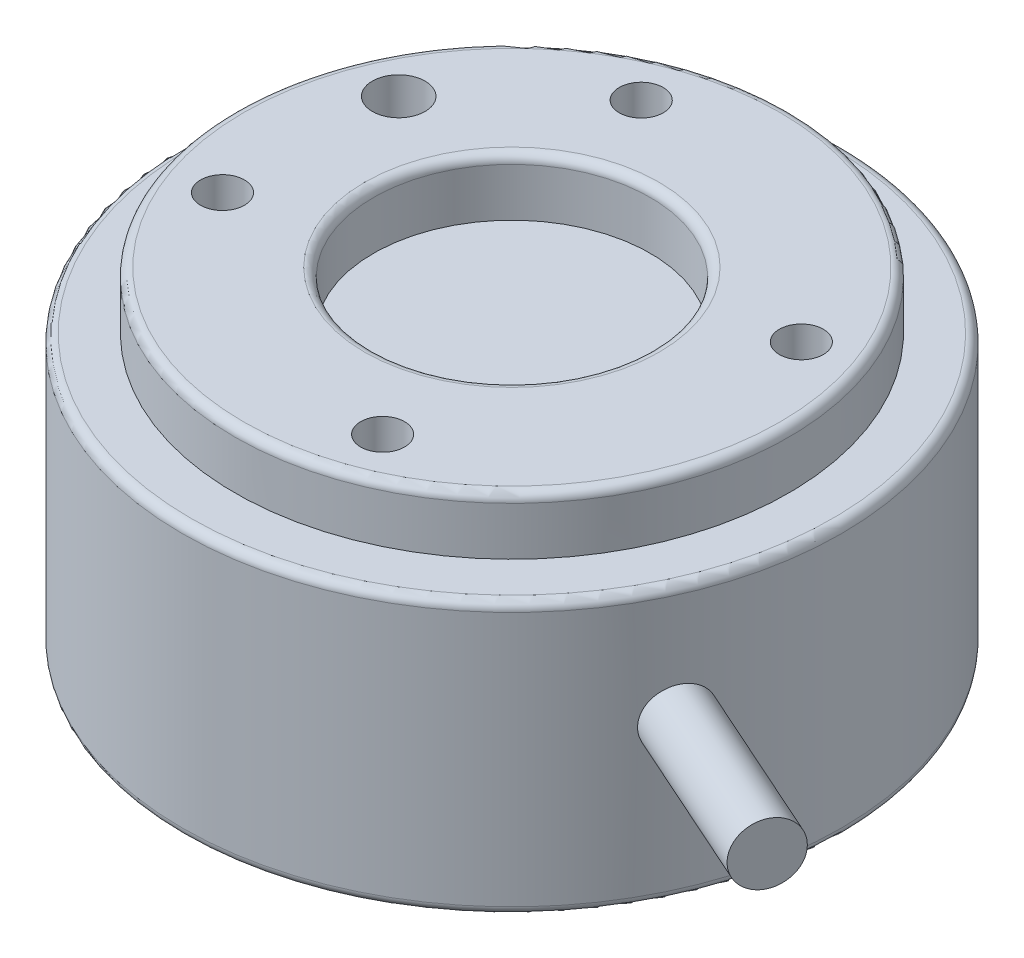
ISO-10303-21;
HEADER;
FILE_DESCRIPTION(('STEP AP214'),'2;1');
FILE_NAME('part.step','',(''),(''),'','','');
FILE_SCHEMA(('AUTOMOTIVE_DESIGN { 1 0 10303 214 1 1 1 1 }'));
ENDSEC;
DATA;
#1=APPLICATION_CONTEXT('core data for automotive mechanical design processes');
#2=APPLICATION_PROTOCOL_DEFINITION('international standard','automotive_design',2000,#1);
#3=PRODUCT_CONTEXT('',#1,'mechanical');
#4=PRODUCT('Part','Part','',(#3));
#5=PRODUCT_RELATED_PRODUCT_CATEGORY('part','',(#4));
#6=PRODUCT_DEFINITION_FORMATION('','',#4);
#7=PRODUCT_DEFINITION_CONTEXT('part definition',#1,'design');
#8=PRODUCT_DEFINITION('design','',#6,#7);
#9=PRODUCT_DEFINITION_SHAPE('','',#8);
#10=(LENGTH_UNIT() NAMED_UNIT(*) SI_UNIT(.MILLI.,.METRE.));
#11=(NAMED_UNIT(*) PLANE_ANGLE_UNIT() SI_UNIT($,.RADIAN.));
#12=(NAMED_UNIT(*) SI_UNIT($,.STERADIAN.) SOLID_ANGLE_UNIT());
#13=UNCERTAINTY_MEASURE_WITH_UNIT(LENGTH_MEASURE(1.E-05),#10,'distance_accuracy_value','');
#14=(GEOMETRIC_REPRESENTATION_CONTEXT(3) GLOBAL_UNCERTAINTY_ASSIGNED_CONTEXT((#13)) GLOBAL_UNIT_ASSIGNED_CONTEXT((#10,
#11,#12)) REPRESENTATION_CONTEXT('',''));
#15=CARTESIAN_POINT('',(0.,0.,0.));
#16=DIRECTION('',(0.,0.,1.));
#17=DIRECTION('',(1.,0.,0.));
#18=AXIS2_PLACEMENT_3D('',#15,#16,#17);
#19=CARTESIAN_POINT('',(0.,31.,0.));
#20=DIRECTION('',(0.,-1.,0.));
#21=DIRECTION('',(0.,0.,-1.));
#22=AXIS2_PLACEMENT_3D('',#19,#20,#21);
#23=CYLINDRICAL_SURFACE('',#22,37.5);
#24=CARTESIAN_POINT('',(0.,30.,0.));
#25=DIRECTION('',(0.,1.,0.));
#26=DIRECTION('',(0.,0.,1.));
#27=AXIS2_PLACEMENT_3D('',#24,#25,#26);
#28=CIRCLE('',#27,37.5);
#29=CARTESIAN_POINT('',(0.,30.,37.5));
#30=VERTEX_POINT('',#29);
#31=EDGE_CURVE('E43',#30,#30,#28,.F.);
#32=ORIENTED_EDGE('',*,*,#31,.T.);
#33=EDGE_LOOP('',(#32));
#34=FACE_BOUND('',#33,.T.);
#35=CARTESIAN_POINT('',(0.,1.,0.));
#36=DIRECTION('',(0.,1.,0.));
#37=DIRECTION('',(0.,0.,1.));
#38=AXIS2_PLACEMENT_3D('',#35,#36,#37);
#39=CIRCLE('',#38,37.5);
#40=CARTESIAN_POINT('',(0.,1.,37.5));
#41=VERTEX_POINT('',#40);
#42=EDGE_CURVE('E114',#41,#41,#39,.T.);
#43=ORIENTED_EDGE('',*,*,#42,.T.);
#44=EDGE_LOOP('',(#43));
#45=FACE_BOUND('',#44,.T.);
#46=CARTESIAN_POINT('',(35.5027750841729,17.6985110354846,12.0748897022398));
#47=CARTESIAN_POINT('',(35.5027735671707,17.8922912666753,12.0748982575814));
#48=CARTESIAN_POINT('',(35.4974998408249,18.0862014868609,12.0904345941137));
#49=CARTESIAN_POINT('',(35.4764257366582,18.4686510863127,12.152128967292));
#50=CARTESIAN_POINT('',(35.4606135977742,18.6571842192359,12.1983212162594));
#51=CARTESIAN_POINT('',(35.4185837512635,19.0232854826746,12.3198227425315));
#52=CARTESIAN_POINT('',(35.3923721511584,19.2008599785046,12.3951149290025));
#53=CARTESIAN_POINT('',(35.3297776375488,19.540115121248,12.5724145700492));
#54=CARTESIAN_POINT('',(35.2933968196359,19.7017990334983,12.6744165202156));
#55=CARTESIAN_POINT('',(35.210729854704,20.0052268780541,12.9022940142063));
#56=CARTESIAN_POINT('',(35.1644166057546,20.1469144577348,13.0282347690766));
#57=CARTESIAN_POINT('',(35.0625458070521,20.4058429113255,13.2999583003101));
#58=CARTESIAN_POINT('',(35.0069878439722,20.5230826916576,13.4457419637874));
#59=CARTESIAN_POINT('',(34.8874091242811,20.7299791579232,13.7530313979271));
#60=CARTESIAN_POINT('',(34.8233735027163,20.8195864516894,13.9145646501196));
#61=CARTESIAN_POINT('',(34.688155705651,20.9683583757945,14.2483064237494));
#62=CARTESIAN_POINT('',(34.616973680283,21.027523645503,14.4205147208951));
#63=CARTESIAN_POINT('',(34.4692980532228,21.1135680828132,14.7700155649117));
#64=CARTESIAN_POINT('',(34.3928202459387,21.1405392223601,14.9472921398818));
#65=CARTESIAN_POINT('',(34.2363639781648,21.1617142384074,15.3022545134909));
#66=CARTESIAN_POINT('',(34.1563855959117,21.1559188468589,15.4799403029001));
#67=CARTESIAN_POINT('',(33.9955004821784,21.1118002401206,15.8301287526287));
#68=CARTESIAN_POINT('',(33.9145973103032,21.0735759238259,16.0026455226143));
#69=CARTESIAN_POINT('',(33.7541794967074,20.965838444139,16.3382982707877));
#70=CARTESIAN_POINT('',(33.6746648706941,20.8963249270406,16.5014341429064));
#71=CARTESIAN_POINT('',(33.5196039147528,20.7278729658955,16.8141814534328));
#72=CARTESIAN_POINT('',(33.4440637222209,20.6288904988895,16.9637722180007));
#73=CARTESIAN_POINT('',(33.2998000084714,20.4043423498497,17.2452420080395));
#74=CARTESIAN_POINT('',(33.2310766570509,20.2787760058969,17.3771205923564));
#75=CARTESIAN_POINT('',(33.1028111179138,20.0040676758275,17.6202412117298));
#76=CARTESIAN_POINT('',(33.0433040447232,19.8548397035912,17.7314046324775));
#77=CARTESIAN_POINT('',(32.9361540578774,19.5373430249352,17.9296540803863));
#78=CARTESIAN_POINT('',(32.8885111574933,19.3690742972171,18.016740080615));
#79=CARTESIAN_POINT('',(32.8070593774979,19.0182092712622,18.1646365114142));
#80=CARTESIAN_POINT('',(32.7732527862598,18.8356106089585,18.2254425956691));
#81=CARTESIAN_POINT('',(32.7209355871556,18.4612998232377,18.3192052938244));
#82=CARTESIAN_POINT('',(32.7024245843385,18.2695879352705,18.3521626268147));
#83=CARTESIAN_POINT('',(32.6815469486738,17.8832473592448,18.3893162017583));
#84=CARTESIAN_POINT('',(32.6791212020198,17.6886319886012,18.3936177548459));
#85=CARTESIAN_POINT('',(32.6903633603895,17.3013461444718,18.373629736817));
#86=CARTESIAN_POINT('',(32.7040310810459,17.1086756487309,18.3493404932376));
#87=CARTESIAN_POINT('',(32.7468242312955,16.7310967190051,18.272859590412));
#88=CARTESIAN_POINT('',(32.7759221784936,16.5461751135258,18.2207175379089));
#89=CARTESIAN_POINT('',(32.8483150405955,16.1889344780423,18.0898799435359));
#90=CARTESIAN_POINT('',(32.8916102332277,16.0166156946569,18.0111838822119));
#91=CARTESIAN_POINT('',(32.9907448726251,15.688922965665,17.8289512397553));
#92=CARTESIAN_POINT('',(33.0466203586455,15.5335996458275,17.7253432332994));
#93=CARTESIAN_POINT('',(33.1685976749419,15.2448194423955,17.4960267115195));
#94=CARTESIAN_POINT('',(33.2346997204402,15.1113630191207,17.3703177310638));
#95=CARTESIAN_POINT('',(33.3747981186053,14.8696922848133,17.0995937508916));
#96=CARTESIAN_POINT('',(33.448817954364,14.761556274554,16.9545209868136));
#97=CARTESIAN_POINT('',(33.6018499477869,14.5741339941955,16.6491683030406));
#98=CARTESIAN_POINT('',(33.6808620460234,14.4948473807497,16.4888885643577));
#99=CARTESIAN_POINT('',(33.8409938765978,14.3675081062717,16.1576881770345));
#100=CARTESIAN_POINT('',(33.9221101809674,14.3194076011876,15.9867842710123));
#101=CARTESIAN_POINT('',(34.0839199603079,14.2556496826484,15.6388361090936));
#102=CARTESIAN_POINT('',(34.1646134452134,14.2399915034802,15.4617919982203));
#103=CARTESIAN_POINT('',(34.3228608289244,14.241572567345,15.1072424655041));
#104=CARTESIAN_POINT('',(34.4004252610615,14.2586900262557,14.929741189282));
#105=CARTESIAN_POINT('',(34.550648250068,14.3250817813973,14.5787230483644));
#106=CARTESIAN_POINT('',(34.6233068016048,14.3743561125816,14.4052061879999));
#107=CARTESIAN_POINT('',(34.7619965007508,14.5036304802634,14.0672311090573));
#108=CARTESIAN_POINT('',(34.8280282749154,14.5836276084915,13.9027720347388));
#109=CARTESIAN_POINT('',(34.9521388004134,14.7720633839734,13.5877405642708));
#110=CARTESIAN_POINT('',(35.0102176368906,14.8805017267002,13.4371680194581));
#111=CARTESIAN_POINT('',(35.1176360368799,15.1231990514113,13.1538857336228));
#112=CARTESIAN_POINT('',(35.1669437738535,15.2575485221607,13.0212414483281));
#113=CARTESIAN_POINT('',(35.2558901858568,15.5480818727787,12.7784573311066));
#114=CARTESIAN_POINT('',(35.2955265276239,15.7042710072844,12.6683229308176));
#115=CARTESIAN_POINT('',(35.3647429177271,16.0344194738374,12.4737995356422));
#116=CARTESIAN_POINT('',(35.3943005384783,16.2084173311843,12.389468000593));
#117=CARTESIAN_POINT('',(35.4429393961975,16.5688499343821,12.249635844957));
#118=CARTESIAN_POINT('',(35.4620325629605,16.7552702450669,12.1941023975821));
#119=CARTESIAN_POINT('',(35.4848064380101,17.068725307787,12.1276226426225));
#120=CARTESIAN_POINT('',(35.4915413911264,17.1937500019788,12.1078770408674));
#121=CARTESIAN_POINT('',(35.5005262021193,17.4453349807195,12.081507798156));
#122=CARTESIAN_POINT('',(35.5027760753803,17.5718952599996,12.0748841121896));
#123=CARTESIAN_POINT('',(35.5027750841729,17.6985110354846,12.0748897022398));
#124=B_SPLINE_CURVE_WITH_KNOTS('',3,(#46,#47,#48,#49,#50,#51,#52,#53,#54,#55,#56,#57,#58,#59,
#60,#61,#62,#63,#64,#65,#66,#67,#68,#69,#70,#71,#72,#73,#74,#75,#76,#77,#78,#79,#80,#81,#82,#83,
#84,#85,#86,#87,#88,#89,#90,#91,#92,#93,#94,#95,#96,#97,#98,#99,#100,#101,#102,#103,#104,#105,
#106,#107,#108,#109,#110,#111,#112,#113,#114,#115,#116,#117,#118,#119,#120,#121,#122,#123),
.UNSPECIFIED.,.T.,.F.,(4,2,2,2,2,2,2,2,2,2,2,2,2,2,2,2,2,2,2,2,2,2,2,2,2,2,2,2,2,2,2,2,2,2,2,2,
2,2,4),(0.,0.58087835520485,1.16240606935948,1.74359276121974,2.32465977492553,2.90733295001593,
3.49003218315483,4.07376701428432,4.6574895848142,5.23954055932615,5.8215785318164,
6.40184781038706,6.98212364872992,7.56327073449647,8.14443229210424,8.72775634485554,
9.3110810500973,9.89450219187682,10.4779082685293,11.0591691161041,11.6404233048018,
12.2206456961033,12.8008794384746,13.3827970401574,13.9647268902064,14.5484332086706,
15.1321325800163,15.7149343388601,16.2977223420927,16.8783490870632,17.4589764631556,
18.0395488896675,18.620115100105,19.202746772544,19.7855188685226,20.3695794369848,
20.9529727662805,21.3325193032902,21.7120645383988),.UNSPECIFIED.);
#125=CARTESIAN_POINT('',(35.5027750841729,17.6985110354846,12.0748897022398));
#126=VERTEX_POINT('',#125);
#127=EDGE_CURVE('E63',#126,#126,#124,.T.);
#128=ORIENTED_EDGE('',*,*,#127,.F.);
#129=EDGE_LOOP('',(#128));
#130=FACE_BOUND('',#129,.T.);
#131=ADVANCED_FACE('F36',(#34,#45,#130),#23,.T.);
#132=CARTESIAN_POINT('',(0.,31.,0.));
#133=DIRECTION('',(0.,1.,0.));
#134=DIRECTION('',(0.,0.,1.));
#135=AXIS2_PLACEMENT_3D('',#132,#133,#134);
#136=PLANE('',#135);
#137=CARTESIAN_POINT('',(0.,31.,0.));
#138=DIRECTION('',(0.,1.,0.));
#139=DIRECTION('',(0.,0.,1.));
#140=AXIS2_PLACEMENT_3D('',#137,#138,#139);
#141=CIRCLE('',#140,36.5);
#142=CARTESIAN_POINT('',(0.,31.,36.5));
#143=VERTEX_POINT('',#142);
#144=EDGE_CURVE('E111',#143,#143,#141,.T.);
#145=ORIENTED_EDGE('',*,*,#144,.T.);
#146=EDGE_LOOP('',(#145));
#147=FACE_BOUND('',#146,.T.);
#148=CARTESIAN_POINT('',(0.,31.,0.));
#149=DIRECTION('',(0.,1.,0.));
#150=DIRECTION('',(0.,0.,1.));
#151=AXIS2_PLACEMENT_3D('',#148,#149,#150);
#152=CIRCLE('',#151,31.5);
#153=CARTESIAN_POINT('',(0.,31.,-31.5));
#154=VERTEX_POINT('',#153);
#155=EDGE_CURVE('E93',#154,#154,#152,.T.);
#156=ORIENTED_EDGE('',*,*,#155,.F.);
#157=EDGE_LOOP('',(#156));
#158=FACE_BOUND('',#157,.T.);
#159=ADVANCED_FACE('F127',(#147,#158),#136,.T.);
#160=CARTESIAN_POINT('',(0.,0.,0.));
#161=DIRECTION('',(0.,1.,0.));
#162=DIRECTION('',(0.,0.,1.));
#163=AXIS2_PLACEMENT_3D('',#160,#161,#162);
#164=PLANE('',#163);
#165=CARTESIAN_POINT('',(0.,0.,0.));
#166=DIRECTION('',(0.,1.,0.));
#167=DIRECTION('',(0.,0.,1.));
#168=AXIS2_PLACEMENT_3D('',#165,#166,#167);
#169=CIRCLE('',#168,36.5);
#170=CARTESIAN_POINT('',(0.,0.,36.5));
#171=VERTEX_POINT('',#170);
#172=EDGE_CURVE('E11',#171,#171,#169,.F.);
#173=ORIENTED_EDGE('',*,*,#172,.T.);
#174=EDGE_LOOP('',(#173));
#175=FACE_BOUND('',#174,.T.);
#176=CARTESIAN_POINT('',(-23.8181343314998,0.,9.10749564735711));
#177=DIRECTION('',(0.,1.,0.));
#178=DIRECTION('',(0.,0.,1.));
#179=AXIS2_PLACEMENT_3D('',#176,#177,#178);
#180=CIRCLE('',#179,2.49999999999999);
#181=CARTESIAN_POINT('',(-23.8181343314998,0.,11.6074956473571));
#182=VERTEX_POINT('',#181);
#183=EDGE_CURVE('E60',#182,#182,#180,.T.);
#184=ORIENTED_EDGE('',*,*,#183,.T.);
#185=EDGE_LOOP('',(#184));
#186=FACE_BOUND('',#185,.T.);
#187=CARTESIAN_POINT('',(9.10749564735711,0.,23.8181343314998));
#188=DIRECTION('',(0.,1.,0.));
#189=DIRECTION('',(0.,0.,1.));
#190=AXIS2_PLACEMENT_3D('',#187,#188,#189);
#191=CIRCLE('',#190,2.49999999999999);
#192=CARTESIAN_POINT('',(9.10749564735711,0.,26.3181343314998));
#193=VERTEX_POINT('',#192);
#194=EDGE_CURVE('E72',#193,#193,#191,.T.);
#195=ORIENTED_EDGE('',*,*,#194,.T.);
#196=EDGE_LOOP('',(#195));
#197=FACE_BOUND('',#196,.T.);
#198=CARTESIAN_POINT('',(23.8181343314998,0.,-9.10749564735711));
#199=DIRECTION('',(0.,1.,0.));
#200=DIRECTION('',(0.,0.,1.));
#201=AXIS2_PLACEMENT_3D('',#198,#199,#200);
#202=CIRCLE('',#201,2.49999999999999);
#203=CARTESIAN_POINT('',(23.8181343314998,0.,-6.60749564735712));
#204=VERTEX_POINT('',#203);
#205=EDGE_CURVE('E78',#204,#204,#202,.T.);
#206=ORIENTED_EDGE('',*,*,#205,.T.);
#207=EDGE_LOOP('',(#206));
#208=FACE_BOUND('',#207,.T.);
#209=CARTESIAN_POINT('',(-9.10749564735711,0.,-23.8181343314998));
#210=DIRECTION('',(0.,1.,0.));
#211=DIRECTION('',(0.,0.,1.));
#212=AXIS2_PLACEMENT_3D('',#209,#210,#211);
#213=CIRCLE('',#212,2.49999999999999);
#214=CARTESIAN_POINT('',(-9.10749564735711,0.,-21.3181343314998));
#215=VERTEX_POINT('',#214);
#216=EDGE_CURVE('E84',#215,#215,#213,.T.);
#217=ORIENTED_EDGE('',*,*,#216,.T.);
#218=EDGE_LOOP('',(#217));
#219=FACE_BOUND('',#218,.T.);
#220=CARTESIAN_POINT('',(0.,0.,0.));
#221=DIRECTION('',(0.,1.,0.));
#222=DIRECTION('',(0.,0.,1.));
#223=AXIS2_PLACEMENT_3D('',#220,#221,#222);
#224=CIRCLE('',#223,15.8);
#225=CARTESIAN_POINT('',(0.,0.,15.8));
#226=VERTEX_POINT('',#225);
#227=EDGE_CURVE('E96',#226,#226,#224,.F.);
#228=ORIENTED_EDGE('',*,*,#227,.F.);
#229=EDGE_LOOP('',(#228));
#230=FACE_BOUND('',#229,.T.);
#231=ADVANCED_FACE('F130',(#175,#186,#197,#208,#219,#230),#164,.F.);
#232=CARTESIAN_POINT('',(0.,37.5,0.));
#233=DIRECTION('',(0.,-1.,0.));
#234=DIRECTION('',(0.,0.,-1.));
#235=AXIS2_PLACEMENT_3D('',#232,#233,#234);
#236=CYLINDRICAL_SURFACE('',#235,31.5);
#237=CARTESIAN_POINT('',(0.,36.5,0.));
#238=DIRECTION('',(0.,1.,0.));
#239=DIRECTION('',(0.,0.,1.));
#240=AXIS2_PLACEMENT_3D('',#237,#238,#239);
#241=CIRCLE('',#240,31.5);
#242=CARTESIAN_POINT('',(0.,36.5,-31.5));
#243=VERTEX_POINT('',#242);
#244=EDGE_CURVE('E105',#243,#243,#241,.F.);
#245=CARTESIAN_POINT('',(0.,36.5,-31.5));
#246=CARTESIAN_POINT('',(0.,36.4427083333333,-31.5));
#247=CARTESIAN_POINT('',(0.,36.3854166666667,-31.5));
#248=CARTESIAN_POINT('',(0.,36.2708333333333,-31.5));
#249=CARTESIAN_POINT('',(0.,36.2135416666667,-31.5));
#250=CARTESIAN_POINT('',(0.,36.0989583333333,-31.5));
#251=CARTESIAN_POINT('',(0.,36.0416666666667,-31.5));
#252=CARTESIAN_POINT('',(0.,35.9270833333333,-31.5));
#253=CARTESIAN_POINT('',(0.,35.8697916666667,-31.5));
#254=CARTESIAN_POINT('',(0.,35.7552083333333,-31.5));
#255=CARTESIAN_POINT('',(0.,35.6979166666667,-31.5));
#256=CARTESIAN_POINT('',(0.,35.5833333333333,-31.5));
#257=CARTESIAN_POINT('',(0.,35.5260416666667,-31.5));
#258=CARTESIAN_POINT('',(0.,35.4114583333333,-31.5));
#259=CARTESIAN_POINT('',(0.,35.3541666666667,-31.5));
#260=CARTESIAN_POINT('',(0.,35.2395833333333,-31.5));
#261=CARTESIAN_POINT('',(0.,35.1822916666667,-31.5));
#262=CARTESIAN_POINT('',(0.,35.0677083333333,-31.5));
#263=CARTESIAN_POINT('',(0.,35.0104166666667,-31.5));
#264=CARTESIAN_POINT('',(0.,34.8958333333333,-31.5));
#265=CARTESIAN_POINT('',(0.,34.8385416666667,-31.5));
#266=CARTESIAN_POINT('',(0.,34.7239583333333,-31.5));
#267=CARTESIAN_POINT('',(0.,34.6666666666667,-31.5));
#268=CARTESIAN_POINT('',(0.,34.5520833333333,-31.5));
#269=CARTESIAN_POINT('',(0.,34.4947916666667,-31.5));
#270=CARTESIAN_POINT('',(0.,34.3802083333333,-31.5));
#271=CARTESIAN_POINT('',(0.,34.3229166666667,-31.5));
#272=CARTESIAN_POINT('',(0.,34.2083333333333,-31.5));
#273=CARTESIAN_POINT('',(0.,34.1510416666667,-31.5));
#274=CARTESIAN_POINT('',(0.,34.0364583333333,-31.5));
#275=CARTESIAN_POINT('',(0.,33.9791666666667,-31.5));
#276=CARTESIAN_POINT('',(0.,33.8645833333333,-31.5));
#277=CARTESIAN_POINT('',(0.,33.8072916666667,-31.5));
#278=CARTESIAN_POINT('',(0.,33.6927083333333,-31.5));
#279=CARTESIAN_POINT('',(0.,33.6354166666667,-31.5));
#280=CARTESIAN_POINT('',(0.,33.5208333333333,-31.5));
#281=CARTESIAN_POINT('',(0.,33.4635416666667,-31.5));
#282=CARTESIAN_POINT('',(0.,33.3489583333333,-31.5));
#283=CARTESIAN_POINT('',(0.,33.2916666666667,-31.5));
#284=CARTESIAN_POINT('',(0.,33.1770833333333,-31.5));
#285=CARTESIAN_POINT('',(0.,33.1197916666667,-31.5));
#286=CARTESIAN_POINT('',(0.,33.0052083333333,-31.5));
#287=CARTESIAN_POINT('',(0.,32.9479166666667,-31.5));
#288=CARTESIAN_POINT('',(0.,32.8333333333333,-31.5));
#289=CARTESIAN_POINT('',(0.,32.7760416666667,-31.5));
#290=CARTESIAN_POINT('',(0.,32.6614583333333,-31.5));
#291=CARTESIAN_POINT('',(0.,32.6041666666667,-31.5));
#292=CARTESIAN_POINT('',(0.,32.4895833333333,-31.5));
#293=CARTESIAN_POINT('',(0.,32.4322916666667,-31.5));
#294=CARTESIAN_POINT('',(0.,32.3177083333333,-31.5));
#295=CARTESIAN_POINT('',(0.,32.2604166666667,-31.5));
#296=CARTESIAN_POINT('',(0.,32.1458333333333,-31.5));
#297=CARTESIAN_POINT('',(0.,32.0885416666667,-31.5));
#298=CARTESIAN_POINT('',(0.,31.9739583333333,-31.5));
#299=CARTESIAN_POINT('',(0.,31.9166666666667,-31.5));
#300=CARTESIAN_POINT('',(0.,31.8020833333333,-31.5));
#301=CARTESIAN_POINT('',(0.,31.7447916666667,-31.5));
#302=CARTESIAN_POINT('',(0.,31.6302083333333,-31.5));
#303=CARTESIAN_POINT('',(0.,31.5729166666667,-31.5));
#304=CARTESIAN_POINT('',(0.,31.4583333333333,-31.5));
#305=CARTESIAN_POINT('',(0.,31.4010416666667,-31.5));
#306=CARTESIAN_POINT('',(0.,31.2864583333333,-31.5));
#307=CARTESIAN_POINT('',(0.,31.2291666666667,-31.5));
#308=CARTESIAN_POINT('',(0.,31.1145833333333,-31.5));
#309=CARTESIAN_POINT('',(0.,31.0572916666667,-31.5));
#310=CARTESIAN_POINT('',(0.,31.,-31.5));
#311=B_SPLINE_CURVE_WITH_KNOTS('',3,(#245,#246,#247,#248,#249,#250,#251,#252,#253,#254,#255,
#256,#257,#258,#259,#260,#261,#262,#263,#264,#265,#266,#267,#268,#269,#270,#271,#272,#273,#274,
#275,#276,#277,#278,#279,#280,#281,#282,#283,#284,#285,#286,#287,#288,#289,#290,#291,#292,#293,
#294,#295,#296,#297,#298,#299,#300,#301,#302,#303,#304,#305,#306,#307,#308,#309,#310),
.UNSPECIFIED.,.F.,.F.,(4,2,2,2,2,2,2,2,2,2,2,2,2,2,2,2,2,2,2,2,2,2,2,2,2,2,2,2,2,2,2,2,4),(0.,
0.171875000000002,0.343750000000004,0.515625000000006,0.687500000000001,0.859375000000002,
1.03125,1.203125,1.375,1.546875,1.71875,1.890625,2.0625,2.234375,2.40625000000001,2.578125,2.75,
2.921875,3.09375,3.265625,3.4375,3.609375,3.78125,3.953125,4.125,4.296875,4.46875,4.640625,
4.8125,4.984375,5.15625,5.328125,5.5),.UNSPECIFIED.);
#312=EDGE_CURVE('BSEAM134',#243,#154,#311,.T.);
#313=ORIENTED_EDGE('',*,*,#244,.T.);
#314=ORIENTED_EDGE('',*,*,#155,.T.);
#315=ORIENTED_EDGE('',*,*,#312,.T.);
#316=ORIENTED_EDGE('',*,*,#312,.F.);
#317=EDGE_LOOP('',(#313,#315,#314,#316));
#318=FACE_BOUND('',#317,.T.);
#319=ADVANCED_FACE('F134',(#318),#236,.T.);
#320=CARTESIAN_POINT('',(0.,37.5,0.));
#321=DIRECTION('',(0.,1.,0.));
#322=DIRECTION('',(0.,0.,1.));
#323=AXIS2_PLACEMENT_3D('',#320,#321,#322);
#324=PLANE('',#323);
#325=CARTESIAN_POINT('',(0.,37.5,0.));
#326=DIRECTION('',(0.,1.,0.));
#327=DIRECTION('',(0.,0.,1.));
#328=AXIS2_PLACEMENT_3D('',#325,#326,#327);
#329=CIRCLE('',#328,30.5);
#330=CARTESIAN_POINT('',(0.,37.5,30.5));
#331=VERTEX_POINT('',#330);
#332=EDGE_CURVE('E102',#331,#331,#329,.T.);
#333=ORIENTED_EDGE('',*,*,#332,.T.);
#334=EDGE_LOOP('',(#333));
#335=FACE_BOUND('',#334,.T.);
#336=CARTESIAN_POINT('',(0.,37.5,0.));
#337=DIRECTION('',(0.,1.,0.));
#338=DIRECTION('',(0.,0.,1.));
#339=AXIS2_PLACEMENT_3D('',#336,#337,#338);
#340=CIRCLE('',#339,16.75);
#341=CARTESIAN_POINT('',(0.,37.5,16.75));
#342=VERTEX_POINT('',#341);
#343=EDGE_CURVE('E99',#342,#342,#340,.F.);
#344=ORIENTED_EDGE('',*,*,#343,.T.);
#345=EDGE_LOOP('',(#344));
#346=FACE_BOUND('',#345,.T.);
#347=CARTESIAN_POINT('',(-23.2819362328888,37.5,-10.4019923691426));
#348=DIRECTION('',(0.,1.,0.));
#349=DIRECTION('',(0.,0.,1.));
#350=AXIS2_PLACEMENT_3D('',#347,#348,#349);
#351=CIRCLE('',#350,2.99999999999999);
#352=CARTESIAN_POINT('',(-23.2819362328888,37.5,-7.4019923691426));
#353=VERTEX_POINT('',#352);
#354=EDGE_CURVE('E57',#353,#353,#351,.T.);
#355=ORIENTED_EDGE('',*,*,#354,.F.);
#356=EDGE_LOOP('',(#355));
#357=FACE_BOUND('',#356,.T.);
#358=CARTESIAN_POINT('',(-23.8181343314998,37.5,9.10749564735711));
#359=DIRECTION('',(0.,1.,0.));
#360=DIRECTION('',(0.,0.,1.));
#361=AXIS2_PLACEMENT_3D('',#358,#359,#360);
#362=CIRCLE('',#361,2.49999999999999);
#363=CARTESIAN_POINT('',(-23.8181343314998,37.5,11.6074956473571));
#364=VERTEX_POINT('',#363);
#365=EDGE_CURVE('E56',#364,#364,#362,.T.);
#366=ORIENTED_EDGE('',*,*,#365,.F.);
#367=EDGE_LOOP('',(#366));
#368=FACE_BOUND('',#367,.T.);
#369=CARTESIAN_POINT('',(9.10749564735711,37.5,23.8181343314998));
#370=DIRECTION('',(0.,1.,0.));
#371=DIRECTION('',(0.,0.,1.));
#372=AXIS2_PLACEMENT_3D('',#369,#370,#371);
#373=CIRCLE('',#372,2.49999999999999);
#374=CARTESIAN_POINT('',(9.10749564735711,37.5,26.3181343314998));
#375=VERTEX_POINT('',#374);
#376=EDGE_CURVE('E69',#375,#375,#373,.T.);
#377=ORIENTED_EDGE('',*,*,#376,.F.);
#378=EDGE_LOOP('',(#377));
#379=FACE_BOUND('',#378,.T.);
#380=CARTESIAN_POINT('',(23.8181343314998,37.5,-9.10749564735711));
#381=DIRECTION('',(0.,1.,0.));
#382=DIRECTION('',(0.,0.,1.));
#383=AXIS2_PLACEMENT_3D('',#380,#381,#382);
#384=CIRCLE('',#383,2.49999999999999);
#385=CARTESIAN_POINT('',(23.8181343314998,37.5,-6.60749564735712));
#386=VERTEX_POINT('',#385);
#387=EDGE_CURVE('E75',#386,#386,#384,.T.);
#388=ORIENTED_EDGE('',*,*,#387,.F.);
#389=EDGE_LOOP('',(#388));
#390=FACE_BOUND('',#389,.T.);
#391=CARTESIAN_POINT('',(-9.10749564735711,37.5,-23.8181343314998));
#392=DIRECTION('',(0.,1.,0.));
#393=DIRECTION('',(0.,0.,1.));
#394=AXIS2_PLACEMENT_3D('',#391,#392,#393);
#395=CIRCLE('',#394,2.49999999999999);
#396=CARTESIAN_POINT('',(-9.10749564735711,37.5,-21.3181343314998));
#397=VERTEX_POINT('',#396);
#398=EDGE_CURVE('E81',#397,#397,#395,.T.);
#399=ORIENTED_EDGE('',*,*,#398,.F.);
#400=EDGE_LOOP('',(#399));
#401=FACE_BOUND('',#400,.T.);
#402=ADVANCED_FACE('F136',(#335,#346,#357,#368,#379,#390,#401),#324,.T.);
#403=CARTESIAN_POINT('',(0.,31.,0.));
#404=DIRECTION('',(0.,1.,0.));
#405=DIRECTION('',(0.,0.,1.));
#406=AXIS2_PLACEMENT_3D('',#403,#404,#405);
#407=CYLINDRICAL_SURFACE('',#406,15.75);
#408=CARTESIAN_POINT('',(0.,36.5,0.));
#409=DIRECTION('',(0.,1.,0.));
#410=DIRECTION('',(0.,0.,1.));
#411=AXIS2_PLACEMENT_3D('',#408,#409,#410);
#412=CIRCLE('',#411,15.75);
#413=CARTESIAN_POINT('',(0.,36.5,15.75));
#414=VERTEX_POINT('',#413);
#415=EDGE_CURVE('E108',#414,#414,#412,.T.);
#416=CARTESIAN_POINT('',(0.,31.,0.));
#417=DIRECTION('',(0.,1.,0.));
#418=DIRECTION('',(0.,0.,1.));
#419=AXIS2_PLACEMENT_3D('',#416,#417,#418);
#420=CIRCLE('',#419,15.75);
#421=CARTESIAN_POINT('',(0.,31.,15.75));
#422=VERTEX_POINT('',#421);
#423=EDGE_CURVE('E90',#422,#422,#420,.T.);
#424=CARTESIAN_POINT('',(0.,36.5,15.75));
#425=CARTESIAN_POINT('',(0.,36.4427083333333,15.75));
#426=CARTESIAN_POINT('',(0.,36.3854166666667,15.75));
#427=CARTESIAN_POINT('',(0.,36.2708333333333,15.75));
#428=CARTESIAN_POINT('',(0.,36.2135416666667,15.75));
#429=CARTESIAN_POINT('',(0.,36.0989583333333,15.75));
#430=CARTESIAN_POINT('',(0.,36.0416666666667,15.75));
#431=CARTESIAN_POINT('',(0.,35.9270833333333,15.75));
#432=CARTESIAN_POINT('',(0.,35.8697916666667,15.75));
#433=CARTESIAN_POINT('',(0.,35.7552083333333,15.75));
#434=CARTESIAN_POINT('',(0.,35.6979166666667,15.75));
#435=CARTESIAN_POINT('',(0.,35.5833333333333,15.75));
#436=CARTESIAN_POINT('',(0.,35.5260416666667,15.75));
#437=CARTESIAN_POINT('',(0.,35.4114583333333,15.75));
#438=CARTESIAN_POINT('',(0.,35.3541666666667,15.75));
#439=CARTESIAN_POINT('',(0.,35.2395833333333,15.75));
#440=CARTESIAN_POINT('',(0.,35.1822916666667,15.75));
#441=CARTESIAN_POINT('',(0.,35.0677083333333,15.75));
#442=CARTESIAN_POINT('',(0.,35.0104166666667,15.75));
#443=CARTESIAN_POINT('',(0.,34.8958333333333,15.75));
#444=CARTESIAN_POINT('',(0.,34.8385416666667,15.75));
#445=CARTESIAN_POINT('',(0.,34.7239583333333,15.75));
#446=CARTESIAN_POINT('',(0.,34.6666666666667,15.75));
#447=CARTESIAN_POINT('',(0.,34.5520833333333,15.75));
#448=CARTESIAN_POINT('',(0.,34.4947916666667,15.75));
#449=CARTESIAN_POINT('',(0.,34.3802083333333,15.75));
#450=CARTESIAN_POINT('',(0.,34.3229166666667,15.75));
#451=CARTESIAN_POINT('',(0.,34.2083333333333,15.75));
#452=CARTESIAN_POINT('',(0.,34.1510416666667,15.75));
#453=CARTESIAN_POINT('',(0.,34.0364583333333,15.75));
#454=CARTESIAN_POINT('',(0.,33.9791666666667,15.75));
#455=CARTESIAN_POINT('',(0.,33.8645833333333,15.75));
#456=CARTESIAN_POINT('',(0.,33.8072916666667,15.75));
#457=CARTESIAN_POINT('',(0.,33.6927083333333,15.75));
#458=CARTESIAN_POINT('',(0.,33.6354166666667,15.75));
#459=CARTESIAN_POINT('',(0.,33.5208333333333,15.75));
#460=CARTESIAN_POINT('',(0.,33.4635416666667,15.75));
#461=CARTESIAN_POINT('',(0.,33.3489583333333,15.75));
#462=CARTESIAN_POINT('',(0.,33.2916666666667,15.75));
#463=CARTESIAN_POINT('',(0.,33.1770833333333,15.75));
#464=CARTESIAN_POINT('',(0.,33.1197916666667,15.75));
#465=CARTESIAN_POINT('',(0.,33.0052083333333,15.75));
#466=CARTESIAN_POINT('',(0.,32.9479166666667,15.75));
#467=CARTESIAN_POINT('',(0.,32.8333333333333,15.75));
#468=CARTESIAN_POINT('',(0.,32.7760416666667,15.75));
#469=CARTESIAN_POINT('',(0.,32.6614583333333,15.75));
#470=CARTESIAN_POINT('',(0.,32.6041666666667,15.75));
#471=CARTESIAN_POINT('',(0.,32.4895833333333,15.75));
#472=CARTESIAN_POINT('',(0.,32.4322916666667,15.75));
#473=CARTESIAN_POINT('',(0.,32.3177083333333,15.75));
#474=CARTESIAN_POINT('',(0.,32.2604166666667,15.75));
#475=CARTESIAN_POINT('',(0.,32.1458333333333,15.75));
#476=CARTESIAN_POINT('',(0.,32.0885416666667,15.75));
#477=CARTESIAN_POINT('',(0.,31.9739583333333,15.75));
#478=CARTESIAN_POINT('',(0.,31.9166666666667,15.75));
#479=CARTESIAN_POINT('',(0.,31.8020833333333,15.75));
#480=CARTESIAN_POINT('',(0.,31.7447916666667,15.75));
#481=CARTESIAN_POINT('',(0.,31.6302083333333,15.75));
#482=CARTESIAN_POINT('',(0.,31.5729166666667,15.75));
#483=CARTESIAN_POINT('',(0.,31.4583333333333,15.75));
#484=CARTESIAN_POINT('',(0.,31.4010416666667,15.75));
#485=CARTESIAN_POINT('',(0.,31.2864583333333,15.75));
#486=CARTESIAN_POINT('',(0.,31.2291666666667,15.75));
#487=CARTESIAN_POINT('',(0.,31.1145833333333,15.75));
#488=CARTESIAN_POINT('',(0.,31.0572916666667,15.75));
#489=CARTESIAN_POINT('',(0.,31.,15.75));
#490=B_SPLINE_CURVE_WITH_KNOTS('',3,(#424,#425,#426,#427,#428,#429,#430,#431,#432,#433,#434,
#435,#436,#437,#438,#439,#440,#441,#442,#443,#444,#445,#446,#447,#448,#449,#450,#451,#452,#453,
#454,#455,#456,#457,#458,#459,#460,#461,#462,#463,#464,#465,#466,#467,#468,#469,#470,#471,#472,
#473,#474,#475,#476,#477,#478,#479,#480,#481,#482,#483,#484,#485,#486,#487,#488,#489),
.UNSPECIFIED.,.F.,.F.,(4,2,2,2,2,2,2,2,2,2,2,2,2,2,2,2,2,2,2,2,2,2,2,2,2,2,2,2,2,2,2,2,4),(0.,
0.171875000000002,0.343750000000004,0.515624999999999,0.687500000000001,0.859375000000002,
1.03125,1.203125,1.375,1.546875,1.71875,1.890625,2.0625,2.234375,2.40625,2.578125,2.75,2.921875,
3.09375,3.265625,3.4375,3.609375,3.78125,3.953125,4.125,4.296875,4.46875,4.640625,4.8125,
4.984375,5.15625,5.328125,5.5),.UNSPECIFIED.);
#491=EDGE_CURVE('BSEAM143',#414,#422,#490,.T.);
#492=ORIENTED_EDGE('',*,*,#415,.T.);
#493=ORIENTED_EDGE('',*,*,#423,.F.);
#494=ORIENTED_EDGE('',*,*,#491,.T.);
#495=ORIENTED_EDGE('',*,*,#491,.F.);
#496=EDGE_LOOP('',(#492,#494,#493,#495));
#497=FACE_BOUND('',#496,.T.);
#498=ADVANCED_FACE('F143',(#497),#407,.F.);
#499=CARTESIAN_POINT('',(0.,31.,0.));
#500=DIRECTION('',(0.,1.,0.));
#501=DIRECTION('',(0.,0.,1.));
#502=AXIS2_PLACEMENT_3D('',#499,#500,#501);
#503=PLANE('',#502);
#504=ORIENTED_EDGE('',*,*,#423,.T.);
#505=EDGE_LOOP('',(#504));
#506=FACE_BOUND('',#505,.T.);
#507=ADVANCED_FACE('F169',(#506),#503,.T.);
#508=CARTESIAN_POINT('',(0.,-6.2,0.));
#509=DIRECTION('',(0.,1.,0.));
#510=DIRECTION('',(0.,0.,1.));
#511=AXIS2_PLACEMENT_3D('',#508,#509,#510);
#512=CYLINDRICAL_SURFACE('',#511,15.8);
#513=CARTESIAN_POINT('',(0.,-6.2,0.));
#514=DIRECTION('',(0.,-1.,0.));
#515=DIRECTION('',(0.,0.,-1.));
#516=AXIS2_PLACEMENT_3D('',#513,#514,#515);
#517=CIRCLE('',#516,15.8);
#518=CARTESIAN_POINT('',(0.,-6.2,15.8));
#519=VERTEX_POINT('',#518);
#520=EDGE_CURVE('E87',#519,#519,#517,.T.);
#521=CARTESIAN_POINT('',(0.,-6.2,15.8));
#522=CARTESIAN_POINT('',(0.,-6.13541666666667,15.8));
#523=CARTESIAN_POINT('',(0.,-6.07083333333333,15.8));
#524=CARTESIAN_POINT('',(0.,-5.94166666666667,15.8));
#525=CARTESIAN_POINT('',(0.,-5.87708333333333,15.8));
#526=CARTESIAN_POINT('',(0.,-5.74791666666667,15.8));
#527=CARTESIAN_POINT('',(0.,-5.68333333333333,15.8));
#528=CARTESIAN_POINT('',(0.,-5.55416666666667,15.8));
#529=CARTESIAN_POINT('',(0.,-5.48958333333333,15.8));
#530=CARTESIAN_POINT('',(0.,-5.36041666666667,15.8));
#531=CARTESIAN_POINT('',(0.,-5.29583333333333,15.8));
#532=CARTESIAN_POINT('',(0.,-5.16666666666667,15.8));
#533=CARTESIAN_POINT('',(0.,-5.10208333333333,15.8));
#534=CARTESIAN_POINT('',(0.,-4.97291666666667,15.8));
#535=CARTESIAN_POINT('',(0.,-4.90833333333333,15.8));
#536=CARTESIAN_POINT('',(0.,-4.77916666666667,15.8));
#537=CARTESIAN_POINT('',(0.,-4.71458333333333,15.8));
#538=CARTESIAN_POINT('',(0.,-4.58541666666667,15.8));
#539=CARTESIAN_POINT('',(0.,-4.52083333333333,15.8));
#540=CARTESIAN_POINT('',(0.,-4.39166666666667,15.8));
#541=CARTESIAN_POINT('',(0.,-4.32708333333333,15.8));
#542=CARTESIAN_POINT('',(0.,-4.19791666666667,15.8));
#543=CARTESIAN_POINT('',(0.,-4.13333333333333,15.8));
#544=CARTESIAN_POINT('',(0.,-4.00416666666667,15.8));
#545=CARTESIAN_POINT('',(0.,-3.93958333333333,15.8));
#546=CARTESIAN_POINT('',(0.,-3.81041666666667,15.8));
#547=CARTESIAN_POINT('',(0.,-3.74583333333333,15.8));
#548=CARTESIAN_POINT('',(0.,-3.61666666666667,15.8));
#549=CARTESIAN_POINT('',(0.,-3.55208333333333,15.8));
#550=CARTESIAN_POINT('',(0.,-3.42291666666667,15.8));
#551=CARTESIAN_POINT('',(0.,-3.35833333333333,15.8));
#552=CARTESIAN_POINT('',(0.,-3.22916666666667,15.8));
#553=CARTESIAN_POINT('',(0.,-3.16458333333333,15.8));
#554=CARTESIAN_POINT('',(0.,-3.03541666666667,15.8));
#555=CARTESIAN_POINT('',(0.,-2.97083333333333,15.8));
#556=CARTESIAN_POINT('',(0.,-2.84166666666667,15.8));
#557=CARTESIAN_POINT('',(0.,-2.77708333333333,15.8));
#558=CARTESIAN_POINT('',(0.,-2.64791666666667,15.8));
#559=CARTESIAN_POINT('',(0.,-2.58333333333333,15.8));
#560=CARTESIAN_POINT('',(0.,-2.45416666666667,15.8));
#561=CARTESIAN_POINT('',(0.,-2.38958333333333,15.8));
#562=CARTESIAN_POINT('',(0.,-2.26041666666667,15.8));
#563=CARTESIAN_POINT('',(0.,-2.19583333333333,15.8));
#564=CARTESIAN_POINT('',(0.,-2.06666666666667,15.8));
#565=CARTESIAN_POINT('',(0.,-2.00208333333333,15.8));
#566=CARTESIAN_POINT('',(0.,-1.87291666666667,15.8));
#567=CARTESIAN_POINT('',(0.,-1.80833333333333,15.8));
#568=CARTESIAN_POINT('',(0.,-1.67916666666667,15.8));
#569=CARTESIAN_POINT('',(0.,-1.61458333333333,15.8));
#570=CARTESIAN_POINT('',(0.,-1.48541666666667,15.8));
#571=CARTESIAN_POINT('',(0.,-1.42083333333333,15.8));
#572=CARTESIAN_POINT('',(0.,-1.29166666666667,15.8));
#573=CARTESIAN_POINT('',(0.,-1.22708333333333,15.8));
#574=CARTESIAN_POINT('',(0.,-1.09791666666667,15.8));
#575=CARTESIAN_POINT('',(0.,-1.03333333333333,15.8));
#576=CARTESIAN_POINT('',(0.,-0.904166666666667,15.8));
#577=CARTESIAN_POINT('',(0.,-0.839583333333333,15.8));
#578=CARTESIAN_POINT('',(0.,-0.710416666666666,15.8));
#579=CARTESIAN_POINT('',(0.,-0.645833333333333,15.8));
#580=CARTESIAN_POINT('',(0.,-0.516666666666667,15.8));
#581=CARTESIAN_POINT('',(0.,-0.452083333333333,15.8));
#582=CARTESIAN_POINT('',(0.,-0.322916666666667,15.8));
#583=CARTESIAN_POINT('',(0.,-0.258333333333334,15.8));
#584=CARTESIAN_POINT('',(0.,-0.129166666666667,15.8));
#585=CARTESIAN_POINT('',(0.,-0.0645833333333335,15.8));
#586=CARTESIAN_POINT('',(0.,0.,15.8));
#587=B_SPLINE_CURVE_WITH_KNOTS('',3,(#521,#522,#523,#524,#525,#526,#527,#528,#529,#530,#531,
#532,#533,#534,#535,#536,#537,#538,#539,#540,#541,#542,#543,#544,#545,#546,#547,#548,#549,#550,
#551,#552,#553,#554,#555,#556,#557,#558,#559,#560,#561,#562,#563,#564,#565,#566,#567,#568,#569,
#570,#571,#572,#573,#574,#575,#576,#577,#578,#579,#580,#581,#582,#583,#584,#585,#586),
.UNSPECIFIED.,.F.,.F.,(4,2,2,2,2,2,2,2,2,2,2,2,2,2,2,2,2,2,2,2,2,2,2,2,2,2,2,2,2,2,2,2,4),(0.,
0.19375,0.387500000000001,0.58125,0.775,0.96875,1.1625,1.35625,1.55,1.74375,1.9375,2.13125,
2.325,2.51875,2.7125,2.90625,3.1,3.29375,3.4875,3.68125,3.875,4.06875,4.2625,4.45625,4.65,
4.84375,5.0375,5.23125,5.425,5.61875,5.8125,6.00625,6.2),.UNSPECIFIED.);
#588=EDGE_CURVE('BSEAM174',#519,#226,#587,.T.);
#589=ORIENTED_EDGE('',*,*,#520,.F.);
#590=ORIENTED_EDGE('',*,*,#227,.T.);
#591=ORIENTED_EDGE('',*,*,#588,.T.);
#592=ORIENTED_EDGE('',*,*,#588,.F.);
#593=EDGE_LOOP('',(#589,#591,#590,#592));
#594=FACE_BOUND('',#593,.T.);
#595=ADVANCED_FACE('F174',(#594),#512,.T.);
#596=CARTESIAN_POINT('',(0.,-6.2,0.));
#597=DIRECTION('',(0.,-1.,0.));
#598=DIRECTION('',(0.,0.,-1.));
#599=AXIS2_PLACEMENT_3D('',#596,#597,#598);
#600=PLANE('',#599);
#601=ORIENTED_EDGE('',*,*,#520,.T.);
#602=EDGE_LOOP('',(#601));
#603=FACE_BOUND('',#602,.T.);
#604=ADVANCED_FACE('F179',(#603),#600,.T.);
#605=CARTESIAN_POINT('',(-9.10749564735711,37.5,-23.8181343314998));
#606=DIRECTION('',(0.,1.,0.));
#607=DIRECTION('',(0.,0.,1.));
#608=AXIS2_PLACEMENT_3D('',#605,#606,#607);
#609=CYLINDRICAL_SURFACE('',#608,2.49999999999999);
#610=ORIENTED_EDGE('',*,*,#216,.F.);
#611=EDGE_LOOP('',(#610));
#612=FACE_BOUND('',#611,.T.);
#613=ORIENTED_EDGE('',*,*,#398,.T.);
#614=EDGE_LOOP('',(#613));
#615=FACE_BOUND('',#614,.T.);
#616=ADVANCED_FACE('F185',(#612,#615),#609,.F.);
#617=CARTESIAN_POINT('',(23.8181343314998,37.5,-9.10749564735711));
#618=DIRECTION('',(0.,1.,0.));
#619=DIRECTION('',(0.,0.,1.));
#620=AXIS2_PLACEMENT_3D('',#617,#618,#619);
#621=CYLINDRICAL_SURFACE('',#620,2.49999999999999);
#622=ORIENTED_EDGE('',*,*,#205,.F.);
#623=EDGE_LOOP('',(#622));
#624=FACE_BOUND('',#623,.T.);
#625=ORIENTED_EDGE('',*,*,#387,.T.);
#626=EDGE_LOOP('',(#625));
#627=FACE_BOUND('',#626,.T.);
#628=ADVANCED_FACE('F189',(#624,#627),#621,.F.);
#629=CARTESIAN_POINT('',(9.10749564735711,37.5,23.8181343314998));
#630=DIRECTION('',(0.,1.,0.));
#631=DIRECTION('',(0.,0.,1.));
#632=AXIS2_PLACEMENT_3D('',#629,#630,#631);
#633=CYLINDRICAL_SURFACE('',#632,2.49999999999999);
#634=ORIENTED_EDGE('',*,*,#194,.F.);
#635=EDGE_LOOP('',(#634));
#636=FACE_BOUND('',#635,.T.);
#637=ORIENTED_EDGE('',*,*,#376,.T.);
#638=EDGE_LOOP('',(#637));
#639=FACE_BOUND('',#638,.T.);
#640=ADVANCED_FACE('F193',(#636,#639),#633,.F.);
#641=CARTESIAN_POINT('',(-23.8181343314998,37.5,9.10749564735711));
#642=DIRECTION('',(0.,1.,0.));
#643=DIRECTION('',(0.,0.,1.));
#644=AXIS2_PLACEMENT_3D('',#641,#642,#643);
#645=CYLINDRICAL_SURFACE('',#644,2.49999999999999);
#646=ORIENTED_EDGE('',*,*,#183,.F.);
#647=EDGE_LOOP('',(#646));
#648=FACE_BOUND('',#647,.T.);
#649=ORIENTED_EDGE('',*,*,#365,.T.);
#650=EDGE_LOOP('',(#649));
#651=FACE_BOUND('',#650,.T.);
#652=ADVANCED_FACE('F50',(#648,#651),#645,.F.);
#653=CARTESIAN_POINT('',(-23.2819362328888,31.5,-10.4019923691426));
#654=DIRECTION('',(0.,1.,0.));
#655=DIRECTION('',(0.,0.,1.));
#656=AXIS2_PLACEMENT_3D('',#653,#654,#655);
#657=CONICAL_SURFACE('',#656,3.,1.02974425867665);
#658=CARTESIAN_POINT('',(-23.2819362328888,29.6974181429173,-10.4019923691426));
#659=VERTEX_POINT('',#658);
#660=VERTEX_LOOP('',#659);
#661=FACE_BOUND('',#660,.T.);
#662=CARTESIAN_POINT('',(-23.2819362328888,31.5,-10.4019923691426));
#663=DIRECTION('',(0.,1.,0.));
#664=DIRECTION('',(0.,0.,1.));
#665=AXIS2_PLACEMENT_3D('',#662,#663,#664);
#666=CIRCLE('',#665,3.);
#667=CARTESIAN_POINT('',(-23.2819362328888,31.5,-7.40199236914259));
#668=VERTEX_POINT('',#667);
#669=EDGE_CURVE('E54',#668,#668,#666,.T.);
#670=ORIENTED_EDGE('',*,*,#669,.T.);
#671=EDGE_LOOP('',(#670));
#672=FACE_BOUND('',#671,.T.);
#673=ADVANCED_FACE('F46',(#661,#672),#657,.F.);
#674=CARTESIAN_POINT('',(-23.2819362328888,37.5,-10.4019923691426));
#675=DIRECTION('',(0.,1.,0.));
#676=DIRECTION('',(0.,0.,1.));
#677=AXIS2_PLACEMENT_3D('',#674,#675,#676);
#678=CYLINDRICAL_SURFACE('',#677,3.);
#679=ORIENTED_EDGE('',*,*,#669,.F.);
#680=EDGE_LOOP('',(#679));
#681=FACE_BOUND('',#680,.T.);
#682=ORIENTED_EDGE('',*,*,#354,.T.);
#683=EDGE_LOOP('',(#682));
#684=FACE_BOUND('',#683,.T.);
#685=ADVANCED_FACE('F49',(#681,#684),#678,.F.);
#686=CARTESIAN_POINT('',(52.4984836623963,17.6985110354846,23.4554729892431));
#687=DIRECTION('',(0.913017107172109,0.,0.407921269378141));
#688=DIRECTION('',(0.407921269378141,0.,-0.913017107172109));
#689=AXIS2_PLACEMENT_3D('',#686,#687,#688);
#690=PLANE('',#689);
#691=CARTESIAN_POINT('',(52.4984836623963,17.6985110354846,23.4554729892431));
#692=DIRECTION('',(0.913017107172109,0.,0.407921269378141));
#693=DIRECTION('',(0.407921269378141,0.,-0.913017107172109));
#694=AXIS2_PLACEMENT_3D('',#691,#692,#693);
#695=CIRCLE('',#694,3.45775621340266);
#696=CARTESIAN_POINT('',(53.9089759661676,17.6985110354846,20.2984824139758));
#697=VERTEX_POINT('',#696);
#698=EDGE_CURVE('E211',#697,#697,#695,.T.);
#699=ORIENTED_EDGE('',*,*,#698,.T.);
#700=EDGE_LOOP('',(#699));
#701=FACE_BOUND('',#700,.T.);
#702=ADVANCED_FACE('F158',(#701),#690,.T.);
#703=CARTESIAN_POINT('',(-500001.410492304,17.6985110354846,-223392.5393694));
#704=DIRECTION('',(0.913017107172109,0.,0.407921269378141));
#705=DIRECTION('',(0.407921269378141,0.,-0.913017107172109));
#706=AXIS2_PLACEMENT_3D('',#703,#704,#705);
#707=CYLINDRICAL_SURFACE('',#706,3.45775621340266);
#708=ORIENTED_EDGE('',*,*,#698,.F.);
#709=EDGE_LOOP('',(#708));
#710=FACE_BOUND('',#709,.T.);
#711=ORIENTED_EDGE('',*,*,#127,.T.);
#712=EDGE_LOOP('',(#711));
#713=FACE_BOUND('',#712,.T.);
#714=ADVANCED_FACE('F156',(#710,#713),#707,.T.);
#715=CARTESIAN_POINT('',(0.,36.5,0.));
#716=DIRECTION('',(0.,1.,0.));
#717=DIRECTION('',(0.,0.,1.));
#718=AXIS2_PLACEMENT_3D('',#715,#716,#717);
#719=TOROIDAL_SURFACE('',#718,30.5,1.);
#720=ORIENTED_EDGE('',*,*,#244,.F.);
#721=EDGE_LOOP('',(#720));
#722=FACE_BOUND('',#721,.T.);
#723=ORIENTED_EDGE('',*,*,#332,.F.);
#724=EDGE_LOOP('',(#723));
#725=FACE_BOUND('',#724,.T.);
#726=ADVANCED_FACE('F153',(#722,#725),#719,.T.);
#727=CARTESIAN_POINT('',(0.,36.5,0.));
#728=DIRECTION('',(0.,1.,0.));
#729=DIRECTION('',(0.,0.,1.));
#730=AXIS2_PLACEMENT_3D('',#727,#728,#729);
#731=TOROIDAL_SURFACE('',#730,16.75,1.);
#732=ORIENTED_EDGE('',*,*,#343,.F.);
#733=EDGE_LOOP('',(#732));
#734=FACE_BOUND('',#733,.T.);
#735=ORIENTED_EDGE('',*,*,#415,.F.);
#736=EDGE_LOOP('',(#735));
#737=FACE_BOUND('',#736,.T.);
#738=ADVANCED_FACE('F124',(#734,#737),#731,.T.);
#739=CARTESIAN_POINT('',(0.,30.,0.));
#740=DIRECTION('',(0.,1.,0.));
#741=DIRECTION('',(0.,0.,1.));
#742=AXIS2_PLACEMENT_3D('',#739,#740,#741);
#743=TOROIDAL_SURFACE('',#742,36.5,1.);
#744=ORIENTED_EDGE('',*,*,#31,.F.);
#745=EDGE_LOOP('',(#744));
#746=FACE_BOUND('',#745,.T.);
#747=ORIENTED_EDGE('',*,*,#144,.F.);
#748=EDGE_LOOP('',(#747));
#749=FACE_BOUND('',#748,.T.);
#750=ADVANCED_FACE('F121',(#746,#749),#743,.T.);
#751=CARTESIAN_POINT('',(0.,1.,0.));
#752=DIRECTION('',(0.,1.,0.));
#753=DIRECTION('',(0.,0.,1.));
#754=AXIS2_PLACEMENT_3D('',#751,#752,#753);
#755=TOROIDAL_SURFACE('',#754,36.5,1.);
#756=ORIENTED_EDGE('',*,*,#172,.F.);
#757=EDGE_LOOP('',(#756));
#758=FACE_BOUND('',#757,.T.);
#759=ORIENTED_EDGE('',*,*,#42,.F.);
#760=EDGE_LOOP('',(#759));
#761=FACE_BOUND('',#760,.T.);
#762=ADVANCED_FACE('F38',(#758,#761),#755,.T.);
#763=CLOSED_SHELL('',(#131,#159,#231,#319,#402,#498,#507,#595,#604,#616,#628,#640,#652,#673,
#685,#702,#714,#726,#738,#750,#762));
#764=MANIFOLD_SOLID_BREP('B2',#763);
#765=ADVANCED_BREP_SHAPE_REPRESENTATION('',(#18,#764),#14);
#766=SHAPE_DEFINITION_REPRESENTATION(#9,#765);
ENDSEC;
END-ISO-10303-21;
